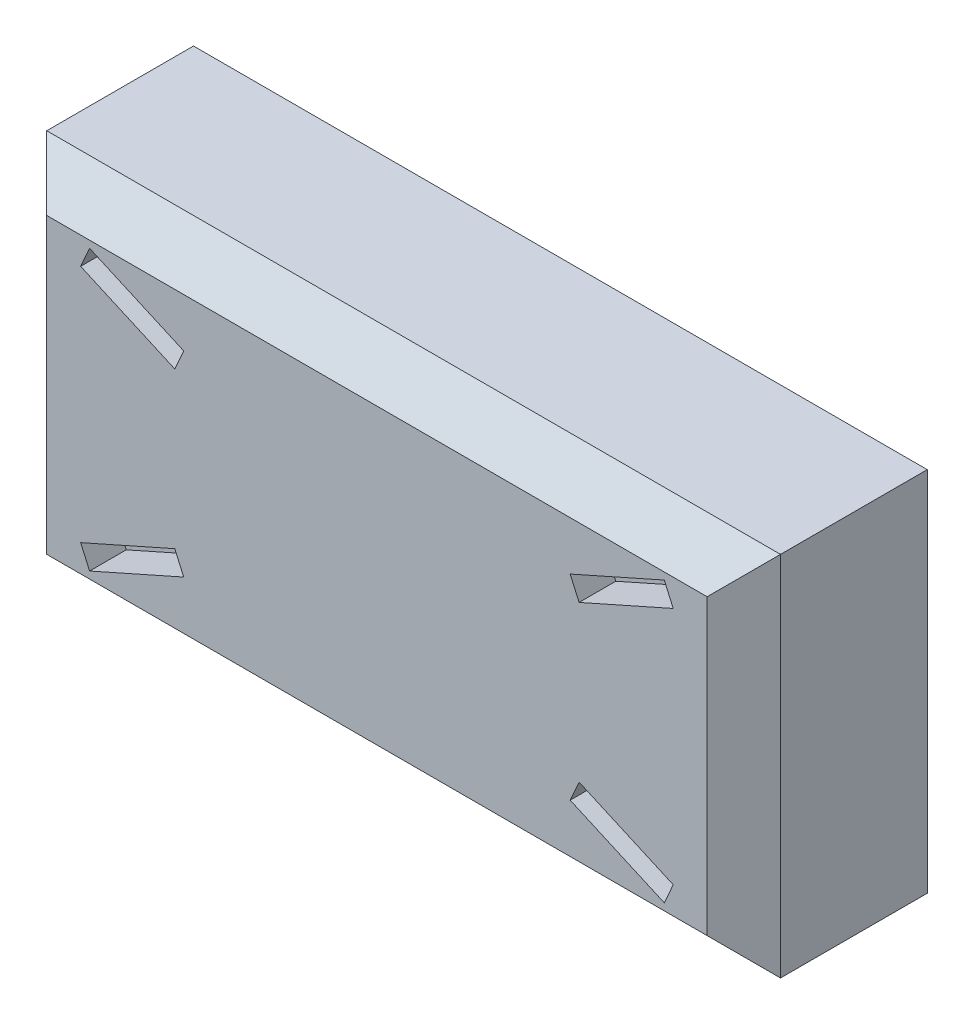
ISO-10303-21;
HEADER;
FILE_DESCRIPTION(('STEP AP214'),'2;1');
FILE_NAME('part.step','',(''),(''),'','','');
FILE_SCHEMA(('AUTOMOTIVE_DESIGN { 1 0 10303 214 1 1 1 1 }'));
ENDSEC;
DATA;
#1=APPLICATION_CONTEXT('core data for automotive mechanical design processes');
#2=APPLICATION_PROTOCOL_DEFINITION('international standard','automotive_design',2000,#1);
#3=PRODUCT_CONTEXT('',#1,'mechanical');
#4=PRODUCT('Part','Part','',(#3));
#5=PRODUCT_RELATED_PRODUCT_CATEGORY('part','',(#4));
#6=PRODUCT_DEFINITION_FORMATION('','',#4);
#7=PRODUCT_DEFINITION_CONTEXT('part definition',#1,'design');
#8=PRODUCT_DEFINITION('design','',#6,#7);
#9=PRODUCT_DEFINITION_SHAPE('','',#8);
#10=(LENGTH_UNIT() NAMED_UNIT(*) SI_UNIT(.MILLI.,.METRE.));
#11=(NAMED_UNIT(*) PLANE_ANGLE_UNIT() SI_UNIT($,.RADIAN.));
#12=(NAMED_UNIT(*) SI_UNIT($,.STERADIAN.) SOLID_ANGLE_UNIT());
#13=UNCERTAINTY_MEASURE_WITH_UNIT(LENGTH_MEASURE(1.E-05),#10,'distance_accuracy_value','');
#14=(GEOMETRIC_REPRESENTATION_CONTEXT(3) GLOBAL_UNCERTAINTY_ASSIGNED_CONTEXT((#13)) GLOBAL_UNIT_ASSIGNED_CONTEXT((#10,
#11,#12)) REPRESENTATION_CONTEXT('',''));
#15=CARTESIAN_POINT('',(0.,0.,0.));
#16=DIRECTION('',(0.,0.,1.));
#17=DIRECTION('',(1.,0.,0.));
#18=AXIS2_PLACEMENT_3D('',#15,#16,#17);
#19=CARTESIAN_POINT('',(10.,-5.,5.));
#20=DIRECTION('',(-1.,0.,0.));
#21=DIRECTION('',(0.,0.,1.));
#22=AXIS2_PLACEMENT_3D('',#19,#20,#21);
#23=PLANE('',#22);
#24=DIRECTION('',(0.,0.,-1.));
#25=VECTOR('',#24,1.);
#26=CARTESIAN_POINT('',(10.,5.,5.));
#27=LINE('',#26,#25);
#28=CARTESIAN_POINT('',(10.,5.,4.));
#29=VERTEX_POINT('',#28);
#30=CARTESIAN_POINT('',(10.,5.,0.));
#31=VERTEX_POINT('',#30);
#32=EDGE_CURVE('E340',#29,#31,#27,.T.);
#33=ORIENTED_EDGE('',*,*,#32,.F.);
#34=DIRECTION('',(0.,-1.,0.));
#35=VECTOR('',#34,1.);
#36=CARTESIAN_POINT('',(10.,-5.,4.));
#37=LINE('',#36,#35);
#38=CARTESIAN_POINT('',(10.,-5.,4.));
#39=VERTEX_POINT('',#38);
#40=EDGE_CURVE('E11',#29,#39,#37,.T.);
#41=ORIENTED_EDGE('',*,*,#40,.T.);
#42=DIRECTION('',(0.,0.,-1.));
#43=VECTOR('',#42,1.);
#44=CARTESIAN_POINT('',(10.,-5.,5.));
#45=LINE('',#44,#43);
#46=CARTESIAN_POINT('',(10.,-5.,0.));
#47=VERTEX_POINT('',#46);
#48=EDGE_CURVE('E334',#39,#47,#45,.T.);
#49=ORIENTED_EDGE('',*,*,#48,.T.);
#50=DIRECTION('',(0.,1.,0.));
#51=VECTOR('',#50,1.);
#52=CARTESIAN_POINT('',(10.,-5.,0.));
#53=LINE('',#52,#51);
#54=EDGE_CURVE('E322',#47,#31,#53,.T.);
#55=ORIENTED_EDGE('',*,*,#54,.T.);
#56=EDGE_LOOP('',(#33,#41,#49,#55));
#57=FACE_BOUND('',#56,.T.);
#58=ADVANCED_FACE('F39',(#57),#23,.F.);
#59=CARTESIAN_POINT('',(-10.,5.,5.));
#60=DIRECTION('',(0.,-1.,0.));
#61=DIRECTION('',(0.,0.,-1.));
#62=AXIS2_PLACEMENT_3D('',#59,#60,#61);
#63=PLANE('',#62);
#64=DIRECTION('',(0.,0.,-1.));
#65=VECTOR('',#64,1.);
#66=CARTESIAN_POINT('',(-10.,5.,5.));
#67=LINE('',#66,#65);
#68=CARTESIAN_POINT('',(-10.,5.,4.));
#69=VERTEX_POINT('',#68);
#70=CARTESIAN_POINT('',(-10.,5.,0.));
#71=VERTEX_POINT('',#70);
#72=EDGE_CURVE('E338',#69,#71,#67,.T.);
#73=ORIENTED_EDGE('',*,*,#72,.F.);
#74=DIRECTION('',(1.,0.,0.));
#75=VECTOR('',#74,1.);
#76=CARTESIAN_POINT('',(-10.,5.,4.));
#77=LINE('',#76,#75);
#78=EDGE_CURVE('E49',#69,#29,#77,.T.);
#79=ORIENTED_EDGE('',*,*,#78,.T.);
#80=ORIENTED_EDGE('',*,*,#32,.T.);
#81=DIRECTION('',(-1.,0.,0.));
#82=VECTOR('',#81,1.);
#83=CARTESIAN_POINT('',(-10.,5.,0.));
#84=LINE('',#83,#82);
#85=EDGE_CURVE('E325',#31,#71,#84,.T.);
#86=ORIENTED_EDGE('',*,*,#85,.T.);
#87=EDGE_LOOP('',(#73,#79,#80,#86));
#88=FACE_BOUND('',#87,.T.);
#89=ADVANCED_FACE('F378',(#88),#63,.F.);
#90=CARTESIAN_POINT('',(-10.,-5.,5.));
#91=DIRECTION('',(1.,0.,0.));
#92=DIRECTION('',(0.,0.,-1.));
#93=AXIS2_PLACEMENT_3D('',#90,#91,#92);
#94=PLANE('',#93);
#95=DIRECTION('',(0.,0.,-1.));
#96=VECTOR('',#95,1.);
#97=CARTESIAN_POINT('',(-10.,-5.,5.));
#98=LINE('',#97,#96);
#99=CARTESIAN_POINT('',(-10.,-5.,4.));
#100=VERTEX_POINT('',#99);
#101=CARTESIAN_POINT('',(-10.,-5.,0.));
#102=VERTEX_POINT('',#101);
#103=EDGE_CURVE('E336',#100,#102,#98,.T.);
#104=ORIENTED_EDGE('',*,*,#103,.F.);
#105=DIRECTION('',(0.,1.,0.));
#106=VECTOR('',#105,1.);
#107=CARTESIAN_POINT('',(-10.,-5.,4.));
#108=LINE('',#107,#106);
#109=EDGE_CURVE('E354',#100,#69,#108,.T.);
#110=ORIENTED_EDGE('',*,*,#109,.T.);
#111=ORIENTED_EDGE('',*,*,#72,.T.);
#112=DIRECTION('',(0.,-1.,0.));
#113=VECTOR('',#112,1.);
#114=CARTESIAN_POINT('',(-10.,-5.,0.));
#115=LINE('',#114,#113);
#116=EDGE_CURVE('E328',#71,#102,#115,.T.);
#117=ORIENTED_EDGE('',*,*,#116,.T.);
#118=EDGE_LOOP('',(#104,#110,#111,#117));
#119=FACE_BOUND('',#118,.T.);
#120=ADVANCED_FACE('F389',(#119),#94,.F.);
#121=CARTESIAN_POINT('',(-10.,-5.,5.));
#122=DIRECTION('',(0.,1.,0.));
#123=DIRECTION('',(0.,0.,1.));
#124=AXIS2_PLACEMENT_3D('',#121,#122,#123);
#125=PLANE('',#124);
#126=ORIENTED_EDGE('',*,*,#48,.F.);
#127=DIRECTION('',(-1.,0.,0.));
#128=VECTOR('',#127,1.);
#129=CARTESIAN_POINT('',(-10.,-5.,4.));
#130=LINE('',#129,#128);
#131=EDGE_CURVE('E351',#39,#100,#130,.T.);
#132=ORIENTED_EDGE('',*,*,#131,.T.);
#133=ORIENTED_EDGE('',*,*,#103,.T.);
#134=DIRECTION('',(1.,0.,0.));
#135=VECTOR('',#134,1.);
#136=CARTESIAN_POINT('',(-10.,-5.,0.));
#137=LINE('',#136,#135);
#138=EDGE_CURVE('E331',#102,#47,#137,.T.);
#139=ORIENTED_EDGE('',*,*,#138,.T.);
#140=EDGE_LOOP('',(#126,#132,#133,#139));
#141=FACE_BOUND('',#140,.T.);
#142=ADVANCED_FACE('F391',(#141),#125,.F.);
#143=CARTESIAN_POINT('',(0.,0.,5.));
#144=DIRECTION('',(0.,0.,-1.));
#145=DIRECTION('',(-1.,0.,0.));
#146=AXIS2_PLACEMENT_3D('',#143,#144,#145);
#147=PLANE('',#146);
#148=DIRECTION('',(0.913811548620257,-0.406138466053447,0.));
#149=VECTOR('',#148,1.);
#150=CARTESIAN_POINT('',(5.26648943621515,-2.66895723171105,5.));
#151=LINE('',#150,#149);
#152=CARTESIAN_POINT('',(5.26648943621515,-2.66895723171105,5.));
#153=VERTEX_POINT('',#152);
#154=CARTESIAN_POINT('',(7.83217307777365,-3.80926107240372,5.));
#155=VERTEX_POINT('',#154);
#156=EDGE_CURVE('E278',#153,#155,#151,.T.);
#157=ORIENTED_EDGE('',*,*,#156,.F.);
#158=DIRECTION('',(-0.406138466053439,-0.913811548620261,0.));
#159=VECTOR('',#158,1.);
#160=CARTESIAN_POINT('',(5.26648943621515,-2.66895723171105,5.));
#161=LINE('',#160,#159);
#162=CARTESIAN_POINT('',(5.51017251584721,-2.12067030253889,5.));
#163=VERTEX_POINT('',#162);
#164=EDGE_CURVE('E57',#163,#153,#161,.T.);
#165=ORIENTED_EDGE('',*,*,#164,.F.);
#166=DIRECTION('',(-0.913811548620257,0.406138466053448,0.));
#167=VECTOR('',#166,1.);
#168=CARTESIAN_POINT('',(5.51017251584721,-2.12067030253889,5.));
#169=LINE('',#168,#167);
#170=CARTESIAN_POINT('',(8.07585615740571,-3.26097414323156,5.));
#171=VERTEX_POINT('',#170);
#172=EDGE_CURVE('E271',#171,#163,#169,.T.);
#173=ORIENTED_EDGE('',*,*,#172,.F.);
#174=DIRECTION('',(0.406138466053434,0.913811548620263,0.));
#175=VECTOR('',#174,1.);
#176=CARTESIAN_POINT('',(8.07585615740571,-3.26097414323156,5.));
#177=LINE('',#176,#175);
#178=EDGE_CURVE('E274',#155,#171,#177,.T.);
#179=ORIENTED_EDGE('',*,*,#178,.F.);
#180=EDGE_LOOP('',(#157,#165,#173,#179));
#181=FACE_BOUND('',#180,.T.);
#182=DIRECTION('',(0.406138466053437,-0.913811548620262,0.));
#183=VECTOR('',#182,1.);
#184=CARTESIAN_POINT('',(5.26648943621515,2.66895723171105,5.));
#185=LINE('',#184,#183);
#186=CARTESIAN_POINT('',(5.26648943621515,2.66895723171105,5.));
#187=VERTEX_POINT('',#186);
#188=CARTESIAN_POINT('',(5.51017251584721,2.12067030253889,5.));
#189=VERTEX_POINT('',#188);
#190=EDGE_CURVE('E248',#187,#189,#185,.T.);
#191=ORIENTED_EDGE('',*,*,#190,.F.);
#192=DIRECTION('',(-0.913811548620257,-0.406138466053447,0.));
#193=VECTOR('',#192,1.);
#194=CARTESIAN_POINT('',(5.26648943621515,2.66895723171105,5.));
#195=LINE('',#194,#193);
#196=CARTESIAN_POINT('',(7.83217307777365,3.80926107240372,5.));
#197=VERTEX_POINT('',#196);
#198=EDGE_CURVE('E65',#197,#187,#195,.T.);
#199=ORIENTED_EDGE('',*,*,#198,.F.);
#200=DIRECTION('',(-0.406138466053434,0.913811548620263,0.));
#201=VECTOR('',#200,1.);
#202=CARTESIAN_POINT('',(8.07585615740571,3.26097414323156,5.));
#203=LINE('',#202,#201);
#204=CARTESIAN_POINT('',(8.07585615740571,3.26097414323156,5.));
#205=VERTEX_POINT('',#204);
#206=EDGE_CURVE('E241',#205,#197,#203,.T.);
#207=ORIENTED_EDGE('',*,*,#206,.F.);
#208=DIRECTION('',(0.913811548620257,0.406138466053448,0.));
#209=VECTOR('',#208,1.);
#210=CARTESIAN_POINT('',(5.51017251584721,2.12067030253889,5.));
#211=LINE('',#210,#209);
#212=EDGE_CURVE('E244',#189,#205,#211,.T.);
#213=ORIENTED_EDGE('',*,*,#212,.F.);
#214=EDGE_LOOP('',(#191,#199,#207,#213));
#215=FACE_BOUND('',#214,.T.);
#216=DIRECTION('',(-0.913811548620257,0.406138466053447,0.));
#217=VECTOR('',#216,1.);
#218=CARTESIAN_POINT('',(-5.26648943621515,2.66895723171105,5.));
#219=LINE('',#218,#217);
#220=CARTESIAN_POINT('',(-5.26648943621515,2.66895723171105,5.));
#221=VERTEX_POINT('',#220);
#222=CARTESIAN_POINT('',(-7.83217307777365,3.80926107240372,5.));
#223=VERTEX_POINT('',#222);
#224=EDGE_CURVE('E214',#221,#223,#219,.T.);
#225=ORIENTED_EDGE('',*,*,#224,.F.);
#226=DIRECTION('',(0.406138466053437,0.913811548620262,0.));
#227=VECTOR('',#226,1.);
#228=CARTESIAN_POINT('',(-5.26648943621515,2.66895723171105,5.));
#229=LINE('',#228,#227);
#230=CARTESIAN_POINT('',(-5.51017251584721,2.12067030253889,5.));
#231=VERTEX_POINT('',#230);
#232=EDGE_CURVE('E193',#231,#221,#229,.T.);
#233=ORIENTED_EDGE('',*,*,#232,.F.);
#234=DIRECTION('',(0.913811548620257,-0.406138466053448,0.));
#235=VECTOR('',#234,1.);
#236=CARTESIAN_POINT('',(-5.51017251584721,2.12067030253889,5.));
#237=LINE('',#236,#235);
#238=CARTESIAN_POINT('',(-8.07585615740571,3.26097414323156,5.));
#239=VERTEX_POINT('',#238);
#240=EDGE_CURVE('E203',#239,#231,#237,.T.);
#241=ORIENTED_EDGE('',*,*,#240,.F.);
#242=DIRECTION('',(-0.406138466053434,-0.913811548620263,0.));
#243=VECTOR('',#242,1.);
#244=CARTESIAN_POINT('',(-8.07585615740571,3.26097414323156,5.));
#245=LINE('',#244,#243);
#246=EDGE_CURVE('E208',#223,#239,#245,.T.);
#247=ORIENTED_EDGE('',*,*,#246,.F.);
#248=EDGE_LOOP('',(#225,#233,#241,#247));
#249=FACE_BOUND('',#248,.T.);
#250=DIRECTION('',(0.406138466053434,-0.913811548620263,0.));
#251=VECTOR('',#250,1.);
#252=CARTESIAN_POINT('',(-8.07585615740571,-3.26097414323156,5.));
#253=LINE('',#252,#251);
#254=CARTESIAN_POINT('',(-8.07585615740572,-3.26097414323156,5.));
#255=VERTEX_POINT('',#254);
#256=CARTESIAN_POINT('',(-7.83217307777365,-3.80926107240372,5.));
#257=VERTEX_POINT('',#256);
#258=EDGE_CURVE('E217',#255,#257,#253,.T.);
#259=ORIENTED_EDGE('',*,*,#258,.F.);
#260=DIRECTION('',(-0.913811548620257,-0.406138466053448,0.));
#261=VECTOR('',#260,1.);
#262=CARTESIAN_POINT('',(-5.51017251584721,-2.12067030253889,5.));
#263=LINE('',#262,#261);
#264=CARTESIAN_POINT('',(-5.51017251584721,-2.12067030253889,5.));
#265=VERTEX_POINT('',#264);
#266=EDGE_CURVE('E215',#265,#255,#263,.T.);
#267=ORIENTED_EDGE('',*,*,#266,.F.);
#268=DIRECTION('',(-0.406138466053439,0.913811548620261,0.));
#269=VECTOR('',#268,1.);
#270=CARTESIAN_POINT('',(-5.26648943621515,-2.66895723171105,5.));
#271=LINE('',#270,#269);
#272=CARTESIAN_POINT('',(-5.26648943621515,-2.66895723171105,5.));
#273=VERTEX_POINT('',#272);
#274=EDGE_CURVE('E296',#273,#265,#271,.T.);
#275=ORIENTED_EDGE('',*,*,#274,.F.);
#276=DIRECTION('',(0.913811548620257,0.406138466053447,0.));
#277=VECTOR('',#276,1.);
#278=CARTESIAN_POINT('',(-5.26648943621515,-2.66895723171105,5.));
#279=LINE('',#278,#277);
#280=EDGE_CURVE('E308',#257,#273,#279,.T.);
#281=ORIENTED_EDGE('',*,*,#280,.F.);
#282=EDGE_LOOP('',(#259,#267,#275,#281));
#283=FACE_BOUND('',#282,.T.);
#284=DIRECTION('',(0.,-1.,0.));
#285=VECTOR('',#284,1.);
#286=CARTESIAN_POINT('',(-9.,0.,5.));
#287=LINE('',#286,#285);
#288=CARTESIAN_POINT('',(-9.,4.,5.));
#289=VERTEX_POINT('',#288);
#290=CARTESIAN_POINT('',(-9.,-4.,5.));
#291=VERTEX_POINT('',#290);
#292=EDGE_CURVE('E346',#289,#291,#287,.T.);
#293=ORIENTED_EDGE('',*,*,#292,.T.);
#294=DIRECTION('',(1.,0.,0.));
#295=VECTOR('',#294,1.);
#296=CARTESIAN_POINT('',(0.,-4.,5.));
#297=LINE('',#296,#295);
#298=CARTESIAN_POINT('',(9.00000000000001,-4.,5.));
#299=VERTEX_POINT('',#298);
#300=EDGE_CURVE('E348',#291,#299,#297,.T.);
#301=ORIENTED_EDGE('',*,*,#300,.T.);
#302=DIRECTION('',(0.,1.,0.));
#303=VECTOR('',#302,1.);
#304=CARTESIAN_POINT('',(9.00000000000001,0.,5.));
#305=LINE('',#304,#303);
#306=CARTESIAN_POINT('',(9.00000000000001,4.,5.));
#307=VERTEX_POINT('',#306);
#308=EDGE_CURVE('E342',#299,#307,#305,.T.);
#309=ORIENTED_EDGE('',*,*,#308,.T.);
#310=DIRECTION('',(-1.,0.,0.));
#311=VECTOR('',#310,1.);
#312=CARTESIAN_POINT('',(0.,4.,5.));
#313=LINE('',#312,#311);
#314=EDGE_CURVE('E344',#307,#289,#313,.T.);
#315=ORIENTED_EDGE('',*,*,#314,.T.);
#316=EDGE_LOOP('',(#293,#301,#309,#315));
#317=FACE_BOUND('',#316,.T.);
#318=ADVANCED_FACE('F211',(#181,#215,#249,#283,#317),#147,.F.);
#319=CARTESIAN_POINT('',(0.,0.,0.));
#320=DIRECTION('',(0.,0.,-1.));
#321=DIRECTION('',(-1.,0.,0.));
#322=AXIS2_PLACEMENT_3D('',#319,#320,#321);
#323=PLANE('',#322);
#324=ORIENTED_EDGE('',*,*,#54,.F.);
#325=ORIENTED_EDGE('',*,*,#138,.F.);
#326=ORIENTED_EDGE('',*,*,#116,.F.);
#327=ORIENTED_EDGE('',*,*,#85,.F.);
#328=EDGE_LOOP('',(#324,#325,#326,#327));
#329=FACE_BOUND('',#328,.T.);
#330=ADVANCED_FACE('F385',(#329),#323,.T.);
#331=CARTESIAN_POINT('',(0.,4.,5.));
#332=DIRECTION('',(0.,-0.707106781186549,-0.707106781186546));
#333=DIRECTION('',(-1.,0.,0.));
#334=AXIS2_PLACEMENT_3D('',#331,#332,#333);
#335=PLANE('',#334);
#336=DIRECTION('',(-0.577350269189625,-0.577350269189625,0.577350269189627));
#337=VECTOR('',#336,1.);
#338=CARTESIAN_POINT('',(7.66666666666667,2.66666666666667,6.33333333333334));
#339=LINE('',#338,#337);
#340=EDGE_CURVE('E359',#29,#307,#339,.T.);
#341=ORIENTED_EDGE('',*,*,#340,.F.);
#342=ORIENTED_EDGE('',*,*,#78,.F.);
#343=DIRECTION('',(0.577350269189625,-0.577350269189625,0.577350269189627));
#344=VECTOR('',#343,1.);
#345=CARTESIAN_POINT('',(-6.00000000000001,1.00000000000001,8.));
#346=LINE('',#345,#344);
#347=EDGE_CURVE('E44',#289,#69,#346,.F.);
#348=ORIENTED_EDGE('',*,*,#347,.F.);
#349=ORIENTED_EDGE('',*,*,#314,.F.);
#350=EDGE_LOOP('',(#341,#342,#348,#349));
#351=FACE_BOUND('',#350,.T.);
#352=ADVANCED_FACE('F42',(#351),#335,.F.);
#353=CARTESIAN_POINT('',(-9.,0.,5.));
#354=DIRECTION('',(0.707106781186549,0.,-0.707106781186546));
#355=DIRECTION('',(0.,-1.,0.));
#356=AXIS2_PLACEMENT_3D('',#353,#354,#355);
#357=PLANE('',#356);
#358=ORIENTED_EDGE('',*,*,#347,.T.);
#359=ORIENTED_EDGE('',*,*,#109,.F.);
#360=DIRECTION('',(0.577350269189625,0.577350269189625,0.577350269189627));
#361=VECTOR('',#360,1.);
#362=CARTESIAN_POINT('',(-7.66666666666667,-2.66666666666667,6.33333333333334));
#363=LINE('',#362,#361);
#364=EDGE_CURVE('E358',#291,#100,#363,.F.);
#365=ORIENTED_EDGE('',*,*,#364,.F.);
#366=ORIENTED_EDGE('',*,*,#292,.F.);
#367=EDGE_LOOP('',(#358,#359,#365,#366));
#368=FACE_BOUND('',#367,.T.);
#369=ADVANCED_FACE('F370',(#368),#357,.F.);
#370=CARTESIAN_POINT('',(9.00000000000001,0.,5.));
#371=DIRECTION('',(-0.707106781186549,0.,-0.707106781186546));
#372=DIRECTION('',(0.,1.,0.));
#373=AXIS2_PLACEMENT_3D('',#370,#371,#372);
#374=PLANE('',#373);
#375=ORIENTED_EDGE('',*,*,#340,.T.);
#376=ORIENTED_EDGE('',*,*,#308,.F.);
#377=DIRECTION('',(0.577350269189625,-0.577350269189625,-0.577350269189627));
#378=VECTOR('',#377,1.);
#379=CARTESIAN_POINT('',(7.66666666666667,-2.66666666666667,6.33333333333334));
#380=LINE('',#379,#378);
#381=EDGE_CURVE('E315',#39,#299,#380,.F.);
#382=ORIENTED_EDGE('',*,*,#381,.F.);
#383=ORIENTED_EDGE('',*,*,#40,.F.);
#384=EDGE_LOOP('',(#375,#376,#382,#383));
#385=FACE_BOUND('',#384,.T.);
#386=ADVANCED_FACE('F397',(#385),#374,.F.);
#387=CARTESIAN_POINT('',(0.,-4.,5.));
#388=DIRECTION('',(0.,0.707106781186549,-0.707106781186546));
#389=DIRECTION('',(1.,0.,0.));
#390=AXIS2_PLACEMENT_3D('',#387,#388,#389);
#391=PLANE('',#390);
#392=ORIENTED_EDGE('',*,*,#364,.T.);
#393=ORIENTED_EDGE('',*,*,#131,.F.);
#394=ORIENTED_EDGE('',*,*,#381,.T.);
#395=ORIENTED_EDGE('',*,*,#300,.F.);
#396=EDGE_LOOP('',(#392,#393,#394,#395));
#397=FACE_BOUND('',#396,.T.);
#398=ADVANCED_FACE('F395',(#397),#391,.F.);
#399=CARTESIAN_POINT('',(-5.51017251584721,-2.12067030253889,4.));
#400=DIRECTION('',(-0.406138466053448,0.913811548620257,0.));
#401=DIRECTION('',(-0.913811548620257,-0.406138466053448,0.));
#402=AXIS2_PLACEMENT_3D('',#399,#400,#401);
#403=PLANE('',#402);
#404=ORIENTED_EDGE('',*,*,#266,.T.);
#405=DIRECTION('',(0.,0.,1.));
#406=VECTOR('',#405,1.);
#407=CARTESIAN_POINT('',(-8.07585615740571,-3.26097414323156,4.));
#408=LINE('',#407,#406);
#409=CARTESIAN_POINT('',(-8.07585615740571,-3.26097414323156,4.));
#410=VERTEX_POINT('',#409);
#411=EDGE_CURVE('E304',#410,#255,#408,.T.);
#412=ORIENTED_EDGE('',*,*,#411,.F.);
#413=DIRECTION('',(-0.913811548620257,-0.406138466053448,0.));
#414=VECTOR('',#413,1.);
#415=CARTESIAN_POINT('',(-5.51017251584721,-2.12067030253889,4.));
#416=LINE('',#415,#414);
#417=CARTESIAN_POINT('',(-5.51017251584721,-2.12067030253889,4.));
#418=VERTEX_POINT('',#417);
#419=EDGE_CURVE('E292',#418,#410,#416,.T.);
#420=ORIENTED_EDGE('',*,*,#419,.F.);
#421=DIRECTION('',(0.,0.,1.));
#422=VECTOR('',#421,1.);
#423=CARTESIAN_POINT('',(-5.51017251584721,-2.12067030253889,4.));
#424=LINE('',#423,#422);
#425=EDGE_CURVE('E313',#418,#265,#424,.T.);
#426=ORIENTED_EDGE('',*,*,#425,.T.);
#427=EDGE_LOOP('',(#404,#412,#420,#426));
#428=FACE_BOUND('',#427,.T.);
#429=ADVANCED_FACE('F425',(#428),#403,.F.);
#430=CARTESIAN_POINT('',(-5.26648943621515,-2.66895723171105,4.));
#431=DIRECTION('',(0.913811548620261,0.406138466053439,0.));
#432=DIRECTION('',(-0.406138466053439,0.913811548620261,0.));
#433=AXIS2_PLACEMENT_3D('',#430,#431,#432);
#434=PLANE('',#433);
#435=ORIENTED_EDGE('',*,*,#274,.T.);
#436=ORIENTED_EDGE('',*,*,#425,.F.);
#437=DIRECTION('',(-0.406138466053439,0.913811548620261,0.));
#438=VECTOR('',#437,1.);
#439=CARTESIAN_POINT('',(-5.26648943621515,-2.66895723171105,4.));
#440=LINE('',#439,#438);
#441=CARTESIAN_POINT('',(-5.26648943621515,-2.66895723171105,4.));
#442=VERTEX_POINT('',#441);
#443=EDGE_CURVE('E302',#442,#418,#440,.T.);
#444=ORIENTED_EDGE('',*,*,#443,.F.);
#445=DIRECTION('',(0.,0.,1.));
#446=VECTOR('',#445,1.);
#447=CARTESIAN_POINT('',(-5.26648943621515,-2.66895723171105,4.));
#448=LINE('',#447,#446);
#449=EDGE_CURVE('E316',#442,#273,#448,.T.);
#450=ORIENTED_EDGE('',*,*,#449,.T.);
#451=EDGE_LOOP('',(#435,#436,#444,#450));
#452=FACE_BOUND('',#451,.T.);
#453=ADVANCED_FACE('F490',(#452),#434,.F.);
#454=CARTESIAN_POINT('',(-5.26648943621515,-2.66895723171105,4.));
#455=DIRECTION('',(0.406138466053447,-0.913811548620257,0.));
#456=DIRECTION('',(0.913811548620257,0.406138466053447,0.));
#457=AXIS2_PLACEMENT_3D('',#454,#455,#456);
#458=PLANE('',#457);
#459=ORIENTED_EDGE('',*,*,#280,.T.);
#460=ORIENTED_EDGE('',*,*,#449,.F.);
#461=DIRECTION('',(0.913811548620257,0.406138466053447,0.));
#462=VECTOR('',#461,1.);
#463=CARTESIAN_POINT('',(-5.26648943621515,-2.66895723171105,4.));
#464=LINE('',#463,#462);
#465=CARTESIAN_POINT('',(-7.83217307777365,-3.80926107240372,4.));
#466=VERTEX_POINT('',#465);
#467=EDGE_CURVE('E299',#466,#442,#464,.T.);
#468=ORIENTED_EDGE('',*,*,#467,.F.);
#469=DIRECTION('',(0.,0.,1.));
#470=VECTOR('',#469,1.);
#471=CARTESIAN_POINT('',(-7.83217307777365,-3.80926107240372,4.));
#472=LINE('',#471,#470);
#473=EDGE_CURVE('E318',#466,#257,#472,.T.);
#474=ORIENTED_EDGE('',*,*,#473,.T.);
#475=EDGE_LOOP('',(#459,#460,#468,#474));
#476=FACE_BOUND('',#475,.T.);
#477=ADVANCED_FACE('F500',(#476),#458,.F.);
#478=CARTESIAN_POINT('',(-8.07585615740571,-3.26097414323156,4.));
#479=DIRECTION('',(-0.913811548620263,-0.406138466053434,0.));
#480=DIRECTION('',(0.406138466053434,-0.913811548620263,0.));
#481=AXIS2_PLACEMENT_3D('',#478,#479,#480);
#482=PLANE('',#481);
#483=ORIENTED_EDGE('',*,*,#258,.T.);
#484=ORIENTED_EDGE('',*,*,#473,.F.);
#485=DIRECTION('',(0.406138466053434,-0.913811548620263,0.));
#486=VECTOR('',#485,1.);
#487=CARTESIAN_POINT('',(-8.07585615740571,-3.26097414323156,4.));
#488=LINE('',#487,#486);
#489=EDGE_CURVE('E295',#410,#466,#488,.T.);
#490=ORIENTED_EDGE('',*,*,#489,.F.);
#491=ORIENTED_EDGE('',*,*,#411,.T.);
#492=EDGE_LOOP('',(#483,#484,#490,#491));
#493=FACE_BOUND('',#492,.T.);
#494=ADVANCED_FACE('F511',(#493),#482,.F.);
#495=CARTESIAN_POINT('',(0.,0.,4.));
#496=DIRECTION('',(0.,0.,1.));
#497=DIRECTION('',(1.,0.,0.));
#498=AXIS2_PLACEMENT_3D('',#495,#496,#497);
#499=PLANE('',#498);
#500=ORIENTED_EDGE('',*,*,#419,.T.);
#501=ORIENTED_EDGE('',*,*,#489,.T.);
#502=ORIENTED_EDGE('',*,*,#467,.T.);
#503=ORIENTED_EDGE('',*,*,#443,.T.);
#504=EDGE_LOOP('',(#500,#501,#502,#503));
#505=FACE_BOUND('',#504,.T.);
#506=ADVANCED_FACE('F522',(#505),#499,.T.);
#507=CARTESIAN_POINT('',(-5.26648943621515,2.66895723171105,4.));
#508=DIRECTION('',(0.913811548620262,-0.406138466053437,0.));
#509=DIRECTION('',(0.406138466053437,0.913811548620262,0.));
#510=AXIS2_PLACEMENT_3D('',#507,#508,#509);
#511=PLANE('',#510);
#512=ORIENTED_EDGE('',*,*,#232,.T.);
#513=DIRECTION('',(0.,0.,1.));
#514=VECTOR('',#513,1.);
#515=CARTESIAN_POINT('',(-5.26648943621515,2.66895723171105,4.));
#516=LINE('',#515,#514);
#517=CARTESIAN_POINT('',(-5.26648943621515,2.66895723171105,4.));
#518=VERTEX_POINT('',#517);
#519=EDGE_CURVE('E225',#518,#221,#516,.T.);
#520=ORIENTED_EDGE('',*,*,#519,.F.);
#521=DIRECTION('',(0.406138466053437,0.913811548620262,0.));
#522=VECTOR('',#521,1.);
#523=CARTESIAN_POINT('',(-5.26648943621515,2.66895723171105,4.));
#524=LINE('',#523,#522);
#525=CARTESIAN_POINT('',(-5.51017251584721,2.12067030253889,4.));
#526=VERTEX_POINT('',#525);
#527=EDGE_CURVE('E196',#526,#518,#524,.T.);
#528=ORIENTED_EDGE('',*,*,#527,.F.);
#529=DIRECTION('',(0.,0.,1.));
#530=VECTOR('',#529,1.);
#531=CARTESIAN_POINT('',(-5.51017251584721,2.12067030253889,4.));
#532=LINE('',#531,#530);
#533=EDGE_CURVE('E189',#526,#231,#532,.T.);
#534=ORIENTED_EDGE('',*,*,#533,.T.);
#535=EDGE_LOOP('',(#512,#520,#528,#534));
#536=FACE_BOUND('',#535,.T.);
#537=ADVANCED_FACE('F191',(#536),#511,.F.);
#538=CARTESIAN_POINT('',(-5.51017251584721,2.12067030253889,4.));
#539=DIRECTION('',(-0.406138466053448,-0.913811548620257,0.));
#540=DIRECTION('',(0.913811548620257,-0.406138466053448,0.));
#541=AXIS2_PLACEMENT_3D('',#538,#539,#540);
#542=PLANE('',#541);
#543=ORIENTED_EDGE('',*,*,#240,.T.);
#544=ORIENTED_EDGE('',*,*,#533,.F.);
#545=DIRECTION('',(0.913811548620257,-0.406138466053448,0.));
#546=VECTOR('',#545,1.);
#547=CARTESIAN_POINT('',(-5.51017251584721,2.12067030253889,4.));
#548=LINE('',#547,#546);
#549=CARTESIAN_POINT('',(-8.07585615740571,3.26097414323156,4.));
#550=VERTEX_POINT('',#549);
#551=EDGE_CURVE('E222',#550,#526,#548,.T.);
#552=ORIENTED_EDGE('',*,*,#551,.F.);
#553=DIRECTION('',(0.,0.,1.));
#554=VECTOR('',#553,1.);
#555=CARTESIAN_POINT('',(-8.07585615740571,3.26097414323156,4.));
#556=LINE('',#555,#554);
#557=EDGE_CURVE('E200',#550,#239,#556,.T.);
#558=ORIENTED_EDGE('',*,*,#557,.T.);
#559=EDGE_LOOP('',(#543,#544,#552,#558));
#560=FACE_BOUND('',#559,.T.);
#561=ADVANCED_FACE('F204',(#560),#542,.F.);
#562=CARTESIAN_POINT('',(-8.07585615740571,3.26097414323156,4.));
#563=DIRECTION('',(-0.913811548620263,0.406138466053434,0.));
#564=DIRECTION('',(-0.406138466053434,-0.913811548620263,0.));
#565=AXIS2_PLACEMENT_3D('',#562,#563,#564);
#566=PLANE('',#565);
#567=ORIENTED_EDGE('',*,*,#246,.T.);
#568=ORIENTED_EDGE('',*,*,#557,.F.);
#569=DIRECTION('',(-0.406138466053434,-0.913811548620263,0.));
#570=VECTOR('',#569,1.);
#571=CARTESIAN_POINT('',(-8.07585615740571,3.26097414323156,4.));
#572=LINE('',#571,#570);
#573=CARTESIAN_POINT('',(-7.83217307777365,3.80926107240372,4.));
#574=VERTEX_POINT('',#573);
#575=EDGE_CURVE('E224',#574,#550,#572,.T.);
#576=ORIENTED_EDGE('',*,*,#575,.F.);
#577=DIRECTION('',(0.,0.,1.));
#578=VECTOR('',#577,1.);
#579=CARTESIAN_POINT('',(-7.83217307777365,3.80926107240372,4.));
#580=LINE('',#579,#578);
#581=EDGE_CURVE('E755',#574,#223,#580,.T.);
#582=ORIENTED_EDGE('',*,*,#581,.T.);
#583=EDGE_LOOP('',(#567,#568,#576,#582));
#584=FACE_BOUND('',#583,.T.);
#585=ADVANCED_FACE('F552',(#584),#566,.F.);
#586=CARTESIAN_POINT('',(-5.26648943621515,2.66895723171105,4.));
#587=DIRECTION('',(0.406138466053447,0.913811548620257,0.));
#588=DIRECTION('',(-0.913811548620257,0.406138466053447,0.));
#589=AXIS2_PLACEMENT_3D('',#586,#587,#588);
#590=PLANE('',#589);
#591=ORIENTED_EDGE('',*,*,#224,.T.);
#592=ORIENTED_EDGE('',*,*,#581,.F.);
#593=DIRECTION('',(-0.913811548620257,0.406138466053447,0.));
#594=VECTOR('',#593,1.);
#595=CARTESIAN_POINT('',(-5.26648943621515,2.66895723171105,4.));
#596=LINE('',#595,#594);
#597=EDGE_CURVE('E228',#518,#574,#596,.T.);
#598=ORIENTED_EDGE('',*,*,#597,.F.);
#599=ORIENTED_EDGE('',*,*,#519,.T.);
#600=EDGE_LOOP('',(#591,#592,#598,#599));
#601=FACE_BOUND('',#600,.T.);
#602=ADVANCED_FACE('F562',(#601),#590,.F.);
#603=CARTESIAN_POINT('',(0.,0.,4.));
#604=DIRECTION('',(0.,0.,-1.));
#605=DIRECTION('',(-1.,0.,0.));
#606=AXIS2_PLACEMENT_3D('',#603,#604,#605);
#607=PLANE('',#606);
#608=ORIENTED_EDGE('',*,*,#527,.T.);
#609=ORIENTED_EDGE('',*,*,#597,.T.);
#610=ORIENTED_EDGE('',*,*,#575,.T.);
#611=ORIENTED_EDGE('',*,*,#551,.T.);
#612=EDGE_LOOP('',(#608,#609,#610,#611));
#613=FACE_BOUND('',#612,.T.);
#614=ADVANCED_FACE('F573',(#613),#607,.F.);
#615=CARTESIAN_POINT('',(5.26648943621515,2.66895723171105,4.));
#616=DIRECTION('',(-0.406138466053447,0.913811548620257,0.));
#617=DIRECTION('',(-0.913811548620257,-0.406138466053447,0.));
#618=AXIS2_PLACEMENT_3D('',#615,#616,#617);
#619=PLANE('',#618);
#620=ORIENTED_EDGE('',*,*,#198,.T.);
#621=DIRECTION('',(0.,0.,1.));
#622=VECTOR('',#621,1.);
#623=CARTESIAN_POINT('',(5.26648943621515,2.66895723171105,4.));
#624=LINE('',#623,#622);
#625=CARTESIAN_POINT('',(5.26648943621515,2.66895723171105,4.));
#626=VERTEX_POINT('',#625);
#627=EDGE_CURVE('E232',#626,#187,#624,.T.);
#628=ORIENTED_EDGE('',*,*,#627,.F.);
#629=DIRECTION('',(-0.913811548620257,-0.406138466053447,0.));
#630=VECTOR('',#629,1.);
#631=CARTESIAN_POINT('',(5.26648943621515,2.66895723171105,4.));
#632=LINE('',#631,#630);
#633=CARTESIAN_POINT('',(7.83217307777365,3.80926107240372,4.));
#634=VERTEX_POINT('',#633);
#635=EDGE_CURVE('E245',#634,#626,#632,.T.);
#636=ORIENTED_EDGE('',*,*,#635,.F.);
#637=DIRECTION('',(0.,0.,1.));
#638=VECTOR('',#637,1.);
#639=CARTESIAN_POINT('',(7.83217307777365,3.80926107240372,4.));
#640=LINE('',#639,#638);
#641=EDGE_CURVE('E239',#634,#197,#640,.T.);
#642=ORIENTED_EDGE('',*,*,#641,.T.);
#643=EDGE_LOOP('',(#620,#628,#636,#642));
#644=FACE_BOUND('',#643,.T.);
#645=ADVANCED_FACE('F584',(#644),#619,.F.);
#646=CARTESIAN_POINT('',(8.07585615740571,3.26097414323156,4.));
#647=DIRECTION('',(0.913811548620263,0.406138466053434,0.));
#648=DIRECTION('',(-0.406138466053434,0.913811548620263,0.));
#649=AXIS2_PLACEMENT_3D('',#646,#647,#648);
#650=PLANE('',#649);
#651=ORIENTED_EDGE('',*,*,#206,.T.);
#652=ORIENTED_EDGE('',*,*,#641,.F.);
#653=DIRECTION('',(-0.406138466053434,0.913811548620263,0.));
#654=VECTOR('',#653,1.);
#655=CARTESIAN_POINT('',(8.07585615740571,3.26097414323156,4.));
#656=LINE('',#655,#654);
#657=CARTESIAN_POINT('',(8.07585615740571,3.26097414323156,4.));
#658=VERTEX_POINT('',#657);
#659=EDGE_CURVE('E234',#658,#634,#656,.T.);
#660=ORIENTED_EDGE('',*,*,#659,.F.);
#661=DIRECTION('',(0.,0.,1.));
#662=VECTOR('',#661,1.);
#663=CARTESIAN_POINT('',(8.07585615740571,3.26097414323156,4.));
#664=LINE('',#663,#662);
#665=EDGE_CURVE('E237',#658,#205,#664,.T.);
#666=ORIENTED_EDGE('',*,*,#665,.T.);
#667=EDGE_LOOP('',(#651,#652,#660,#666));
#668=FACE_BOUND('',#667,.T.);
#669=ADVANCED_FACE('F595',(#668),#650,.F.);
#670=CARTESIAN_POINT('',(5.51017251584721,2.12067030253889,4.));
#671=DIRECTION('',(0.406138466053448,-0.913811548620257,0.));
#672=DIRECTION('',(0.913811548620257,0.406138466053448,0.));
#673=AXIS2_PLACEMENT_3D('',#670,#671,#672);
#674=PLANE('',#673);
#675=ORIENTED_EDGE('',*,*,#212,.T.);
#676=ORIENTED_EDGE('',*,*,#665,.F.);
#677=DIRECTION('',(0.913811548620257,0.406138466053448,0.));
#678=VECTOR('',#677,1.);
#679=CARTESIAN_POINT('',(5.51017251584721,2.12067030253889,4.));
#680=LINE('',#679,#678);
#681=CARTESIAN_POINT('',(5.51017251584721,2.12067030253889,4.));
#682=VERTEX_POINT('',#681);
#683=EDGE_CURVE('E254',#682,#658,#680,.T.);
#684=ORIENTED_EDGE('',*,*,#683,.F.);
#685=DIRECTION('',(0.,0.,1.));
#686=VECTOR('',#685,1.);
#687=CARTESIAN_POINT('',(5.51017251584721,2.12067030253889,4.));
#688=LINE('',#687,#686);
#689=EDGE_CURVE('E235',#682,#189,#688,.T.);
#690=ORIENTED_EDGE('',*,*,#689,.T.);
#691=EDGE_LOOP('',(#675,#676,#684,#690));
#692=FACE_BOUND('',#691,.T.);
#693=ADVANCED_FACE('F605',(#692),#674,.F.);
#694=CARTESIAN_POINT('',(5.26648943621515,2.66895723171105,4.));
#695=DIRECTION('',(-0.913811548620262,-0.406138466053437,0.));
#696=DIRECTION('',(0.406138466053437,-0.913811548620262,0.));
#697=AXIS2_PLACEMENT_3D('',#694,#695,#696);
#698=PLANE('',#697);
#699=ORIENTED_EDGE('',*,*,#190,.T.);
#700=ORIENTED_EDGE('',*,*,#689,.F.);
#701=DIRECTION('',(0.406138466053437,-0.913811548620262,0.));
#702=VECTOR('',#701,1.);
#703=CARTESIAN_POINT('',(5.26648943621515,2.66895723171105,4.));
#704=LINE('',#703,#702);
#705=EDGE_CURVE('E257',#626,#682,#704,.T.);
#706=ORIENTED_EDGE('',*,*,#705,.F.);
#707=ORIENTED_EDGE('',*,*,#627,.T.);
#708=EDGE_LOOP('',(#699,#700,#706,#707));
#709=FACE_BOUND('',#708,.T.);
#710=ADVANCED_FACE('F616',(#709),#698,.F.);
#711=CARTESIAN_POINT('',(0.,0.,4.));
#712=DIRECTION('',(0.,0.,1.));
#713=DIRECTION('',(1.,0.,0.));
#714=AXIS2_PLACEMENT_3D('',#711,#712,#713);
#715=PLANE('',#714);
#716=ORIENTED_EDGE('',*,*,#635,.T.);
#717=ORIENTED_EDGE('',*,*,#705,.T.);
#718=ORIENTED_EDGE('',*,*,#683,.T.);
#719=ORIENTED_EDGE('',*,*,#659,.T.);
#720=EDGE_LOOP('',(#716,#717,#718,#719));
#721=FACE_BOUND('',#720,.T.);
#722=ADVANCED_FACE('F627',(#721),#715,.T.);
#723=CARTESIAN_POINT('',(5.26648943621515,-2.66895723171105,4.));
#724=DIRECTION('',(-0.913811548620261,0.406138466053439,0.));
#725=DIRECTION('',(-0.406138466053439,-0.913811548620261,0.));
#726=AXIS2_PLACEMENT_3D('',#723,#724,#725);
#727=PLANE('',#726);
#728=ORIENTED_EDGE('',*,*,#164,.T.);
#729=DIRECTION('',(0.,0.,1.));
#730=VECTOR('',#729,1.);
#731=CARTESIAN_POINT('',(5.26648943621515,-2.66895723171105,4.));
#732=LINE('',#731,#730);
#733=CARTESIAN_POINT('',(5.26648943621515,-2.66895723171105,4.));
#734=VERTEX_POINT('',#733);
#735=EDGE_CURVE('E262',#734,#153,#732,.T.);
#736=ORIENTED_EDGE('',*,*,#735,.F.);
#737=DIRECTION('',(-0.406138466053439,-0.913811548620261,0.));
#738=VECTOR('',#737,1.);
#739=CARTESIAN_POINT('',(5.26648943621515,-2.66895723171105,4.));
#740=LINE('',#739,#738);
#741=CARTESIAN_POINT('',(5.51017251584721,-2.12067030253889,4.));
#742=VERTEX_POINT('',#741);
#743=EDGE_CURVE('E275',#742,#734,#740,.T.);
#744=ORIENTED_EDGE('',*,*,#743,.F.);
#745=DIRECTION('',(0.,0.,1.));
#746=VECTOR('',#745,1.);
#747=CARTESIAN_POINT('',(5.51017251584721,-2.12067030253889,4.));
#748=LINE('',#747,#746);
#749=EDGE_CURVE('E269',#742,#163,#748,.T.);
#750=ORIENTED_EDGE('',*,*,#749,.T.);
#751=EDGE_LOOP('',(#728,#736,#744,#750));
#752=FACE_BOUND('',#751,.T.);
#753=ADVANCED_FACE('F638',(#752),#727,.F.);
#754=CARTESIAN_POINT('',(5.51017251584721,-2.12067030253889,4.));
#755=DIRECTION('',(0.406138466053448,0.913811548620257,0.));
#756=DIRECTION('',(-0.913811548620257,0.406138466053448,0.));
#757=AXIS2_PLACEMENT_3D('',#754,#755,#756);
#758=PLANE('',#757);
#759=ORIENTED_EDGE('',*,*,#172,.T.);
#760=ORIENTED_EDGE('',*,*,#749,.F.);
#761=DIRECTION('',(-0.913811548620257,0.406138466053448,0.));
#762=VECTOR('',#761,1.);
#763=CARTESIAN_POINT('',(5.51017251584721,-2.12067030253889,4.));
#764=LINE('',#763,#762);
#765=CARTESIAN_POINT('',(8.07585615740571,-3.26097414323156,4.));
#766=VERTEX_POINT('',#765);
#767=EDGE_CURVE('E264',#766,#742,#764,.T.);
#768=ORIENTED_EDGE('',*,*,#767,.F.);
#769=DIRECTION('',(0.,0.,1.));
#770=VECTOR('',#769,1.);
#771=CARTESIAN_POINT('',(8.07585615740571,-3.26097414323156,4.));
#772=LINE('',#771,#770);
#773=EDGE_CURVE('E267',#766,#171,#772,.T.);
#774=ORIENTED_EDGE('',*,*,#773,.T.);
#775=EDGE_LOOP('',(#759,#760,#768,#774));
#776=FACE_BOUND('',#775,.T.);
#777=ADVANCED_FACE('F649',(#776),#758,.F.);
#778=CARTESIAN_POINT('',(8.07585615740571,-3.26097414323156,4.));
#779=DIRECTION('',(0.913811548620263,-0.406138466053434,0.));
#780=DIRECTION('',(0.406138466053434,0.913811548620263,0.));
#781=AXIS2_PLACEMENT_3D('',#778,#779,#780);
#782=PLANE('',#781);
#783=ORIENTED_EDGE('',*,*,#178,.T.);
#784=ORIENTED_EDGE('',*,*,#773,.F.);
#785=DIRECTION('',(0.406138466053434,0.913811548620263,0.));
#786=VECTOR('',#785,1.);
#787=CARTESIAN_POINT('',(8.07585615740571,-3.26097414323156,4.));
#788=LINE('',#787,#786);
#789=CARTESIAN_POINT('',(7.83217307777365,-3.80926107240372,4.));
#790=VERTEX_POINT('',#789);
#791=EDGE_CURVE('E284',#790,#766,#788,.T.);
#792=ORIENTED_EDGE('',*,*,#791,.F.);
#793=DIRECTION('',(0.,0.,1.));
#794=VECTOR('',#793,1.);
#795=CARTESIAN_POINT('',(7.83217307777365,-3.80926107240372,4.));
#796=LINE('',#795,#794);
#797=EDGE_CURVE('E265',#790,#155,#796,.T.);
#798=ORIENTED_EDGE('',*,*,#797,.T.);
#799=EDGE_LOOP('',(#783,#784,#792,#798));
#800=FACE_BOUND('',#799,.T.);
#801=ADVANCED_FACE('F659',(#800),#782,.F.);
#802=CARTESIAN_POINT('',(5.26648943621515,-2.66895723171105,4.));
#803=DIRECTION('',(-0.406138466053447,-0.913811548620257,0.));
#804=DIRECTION('',(0.913811548620257,-0.406138466053447,0.));
#805=AXIS2_PLACEMENT_3D('',#802,#803,#804);
#806=PLANE('',#805);
#807=ORIENTED_EDGE('',*,*,#156,.T.);
#808=ORIENTED_EDGE('',*,*,#797,.F.);
#809=DIRECTION('',(0.913811548620257,-0.406138466053447,0.));
#810=VECTOR('',#809,1.);
#811=CARTESIAN_POINT('',(5.26648943621515,-2.66895723171105,4.));
#812=LINE('',#811,#810);
#813=EDGE_CURVE('E287',#734,#790,#812,.T.);
#814=ORIENTED_EDGE('',*,*,#813,.F.);
#815=ORIENTED_EDGE('',*,*,#735,.T.);
#816=EDGE_LOOP('',(#807,#808,#814,#815));
#817=FACE_BOUND('',#816,.T.);
#818=ADVANCED_FACE('F670',(#817),#806,.F.);
#819=CARTESIAN_POINT('',(0.,0.,4.));
#820=DIRECTION('',(0.,0.,-1.));
#821=DIRECTION('',(-1.,0.,0.));
#822=AXIS2_PLACEMENT_3D('',#819,#820,#821);
#823=PLANE('',#822);
#824=ORIENTED_EDGE('',*,*,#743,.T.);
#825=ORIENTED_EDGE('',*,*,#813,.T.);
#826=ORIENTED_EDGE('',*,*,#791,.T.);
#827=ORIENTED_EDGE('',*,*,#767,.T.);
#828=EDGE_LOOP('',(#824,#825,#826,#827));
#829=FACE_BOUND('',#828,.T.);
#830=ADVANCED_FACE('F681',(#829),#823,.F.);
#831=CLOSED_SHELL('',(#58,#89,#120,#142,#318,#330,#352,#369,#386,#398,#429,#453,#477,#494,#506,
#537,#561,#585,#602,#614,#645,#669,#693,#710,#722,#753,#777,#801,#818,#830));
#832=MANIFOLD_SOLID_BREP('B2',#831);
#833=ADVANCED_BREP_SHAPE_REPRESENTATION('',(#18,#832),#14);
#834=SHAPE_DEFINITION_REPRESENTATION(#9,#833);
ENDSEC;
END-ISO-10303-21;
